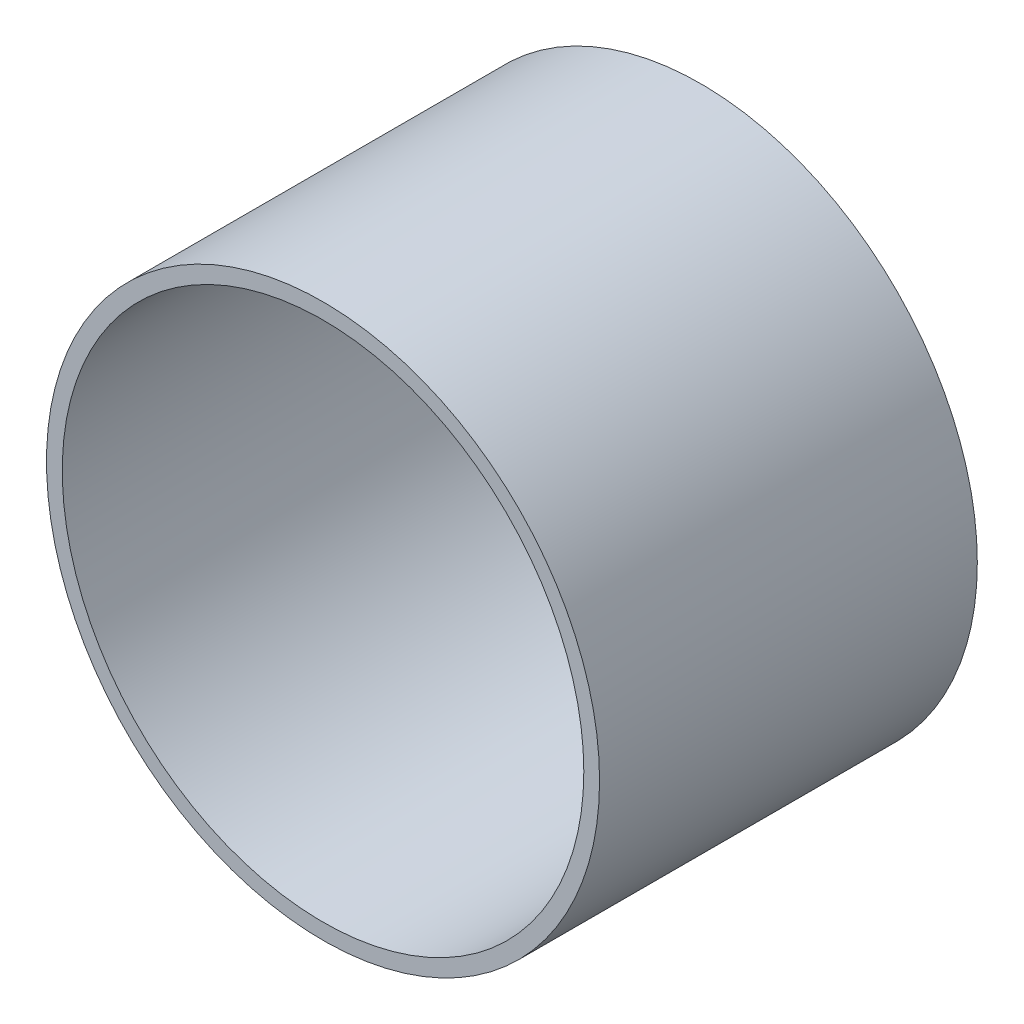
ISO-10303-21;
HEADER;
FILE_DESCRIPTION(('STEP AP214'),'2;1');
FILE_NAME('part.step','',(''),(''),'','','');
FILE_SCHEMA(('AUTOMOTIVE_DESIGN { 1 0 10303 214 1 1 1 1 }'));
ENDSEC;
DATA;
#1=APPLICATION_CONTEXT('core data for automotive mechanical design processes');
#2=APPLICATION_PROTOCOL_DEFINITION('international standard','automotive_design',2000,#1);
#3=PRODUCT_CONTEXT('',#1,'mechanical');
#4=PRODUCT('Part','Part','',(#3));
#5=PRODUCT_RELATED_PRODUCT_CATEGORY('part','',(#4));
#6=PRODUCT_DEFINITION_FORMATION('','',#4);
#7=PRODUCT_DEFINITION_CONTEXT('part definition',#1,'design');
#8=PRODUCT_DEFINITION('design','',#6,#7);
#9=PRODUCT_DEFINITION_SHAPE('','',#8);
#10=(LENGTH_UNIT() NAMED_UNIT(*) SI_UNIT(.MILLI.,.METRE.));
#11=(NAMED_UNIT(*) PLANE_ANGLE_UNIT() SI_UNIT($,.RADIAN.));
#12=(NAMED_UNIT(*) SI_UNIT($,.STERADIAN.) SOLID_ANGLE_UNIT());
#13=UNCERTAINTY_MEASURE_WITH_UNIT(LENGTH_MEASURE(1.E-05),#10,'distance_accuracy_value','');
#14=(GEOMETRIC_REPRESENTATION_CONTEXT(3) GLOBAL_UNCERTAINTY_ASSIGNED_CONTEXT((#13)) GLOBAL_UNIT_ASSIGNED_CONTEXT((#10,
#11,#12)) REPRESENTATION_CONTEXT('',''));
#15=CARTESIAN_POINT('',(0.,0.,0.));
#16=DIRECTION('',(0.,0.,1.));
#17=DIRECTION('',(1.,0.,0.));
#18=AXIS2_PLACEMENT_3D('',#15,#16,#17);
#19=CARTESIAN_POINT('',(0.,0.,68.3));
#20=DIRECTION('',(0.,0.,1.));
#21=DIRECTION('',(1.,0.,0.));
#22=AXIS2_PLACEMENT_3D('',#19,#20,#21);
#23=PLANE('',#22);
#24=CARTESIAN_POINT('',(0.,0.,68.3));
#25=DIRECTION('',(0.,0.,1.));
#26=DIRECTION('',(1.,0.,0.));
#27=AXIS2_PLACEMENT_3D('',#24,#25,#26);
#28=CIRCLE('',#27,50.);
#29=CARTESIAN_POINT('',(50.,0.,68.3));
#30=VERTEX_POINT('',#29);
#31=EDGE_CURVE('E10',#30,#30,#28,.T.);
#32=ORIENTED_EDGE('',*,*,#31,.T.);
#33=EDGE_LOOP('',(#32));
#34=FACE_BOUND('',#33,.T.);
#35=CARTESIAN_POINT('',(0.,0.,68.3));
#36=DIRECTION('',(0.,0.,1.));
#37=DIRECTION('',(1.,0.,0.));
#38=AXIS2_PLACEMENT_3D('',#35,#36,#37);
#39=CIRCLE('',#38,47.15);
#40=CARTESIAN_POINT('',(47.15,0.,68.3));
#41=VERTEX_POINT('',#40);
#42=EDGE_CURVE('E42',#41,#41,#39,.T.);
#43=ORIENTED_EDGE('',*,*,#42,.F.);
#44=EDGE_LOOP('',(#43));
#45=FACE_BOUND('',#44,.T.);
#46=ADVANCED_FACE('F31',(#34,#45),#23,.T.);
#47=CARTESIAN_POINT('',(0.,0.,0.));
#48=DIRECTION('',(0.,0.,1.));
#49=DIRECTION('',(1.,0.,0.));
#50=AXIS2_PLACEMENT_3D('',#47,#48,#49);
#51=PLANE('',#50);
#52=CARTESIAN_POINT('',(0.,0.,0.));
#53=DIRECTION('',(0.,0.,1.));
#54=DIRECTION('',(1.,0.,0.));
#55=AXIS2_PLACEMENT_3D('',#52,#53,#54);
#56=CIRCLE('',#55,50.);
#57=CARTESIAN_POINT('',(50.,0.,0.));
#58=VERTEX_POINT('',#57);
#59=EDGE_CURVE('E35',#58,#58,#56,.T.);
#60=ORIENTED_EDGE('',*,*,#59,.F.);
#61=EDGE_LOOP('',(#60));
#62=FACE_BOUND('',#61,.T.);
#63=CARTESIAN_POINT('',(0.,0.,0.));
#64=DIRECTION('',(0.,0.,1.));
#65=DIRECTION('',(1.,0.,0.));
#66=AXIS2_PLACEMENT_3D('',#63,#64,#65);
#67=CIRCLE('',#66,47.15);
#68=CARTESIAN_POINT('',(47.15,0.,0.));
#69=VERTEX_POINT('',#68);
#70=EDGE_CURVE('E44',#69,#69,#67,.T.);
#71=ORIENTED_EDGE('',*,*,#70,.T.);
#72=EDGE_LOOP('',(#71));
#73=FACE_BOUND('',#72,.T.);
#74=ADVANCED_FACE('F54',(#62,#73),#51,.F.);
#75=CARTESIAN_POINT('',(0.,0.,68.3));
#76=DIRECTION('',(0.,0.,-1.));
#77=DIRECTION('',(-1.,0.,0.));
#78=AXIS2_PLACEMENT_3D('',#75,#76,#77);
#79=CYLINDRICAL_SURFACE('',#78,50.);
#80=ORIENTED_EDGE('',*,*,#31,.F.);
#81=EDGE_LOOP('',(#80));
#82=FACE_BOUND('',#81,.T.);
#83=ORIENTED_EDGE('',*,*,#59,.T.);
#84=EDGE_LOOP('',(#83));
#85=FACE_BOUND('',#84,.T.);
#86=ADVANCED_FACE('F33',(#82,#85),#79,.T.);
#87=CARTESIAN_POINT('',(0.,0.,68.3));
#88=DIRECTION('',(0.,0.,-1.));
#89=DIRECTION('',(-1.,0.,0.));
#90=AXIS2_PLACEMENT_3D('',#87,#88,#89);
#91=CYLINDRICAL_SURFACE('',#90,47.15);
#92=ORIENTED_EDGE('',*,*,#42,.T.);
#93=EDGE_LOOP('',(#92));
#94=FACE_BOUND('',#93,.T.);
#95=ORIENTED_EDGE('',*,*,#70,.F.);
#96=EDGE_LOOP('',(#95));
#97=FACE_BOUND('',#96,.T.);
#98=ADVANCED_FACE('F50',(#94,#97),#91,.F.);
#99=CLOSED_SHELL('',(#46,#74,#86,#98));
#100=MANIFOLD_SOLID_BREP('B2',#99);
#101=ADVANCED_BREP_SHAPE_REPRESENTATION('',(#18,#100),#14);
#102=SHAPE_DEFINITION_REPRESENTATION(#9,#101);
ENDSEC;
END-ISO-10303-21;
